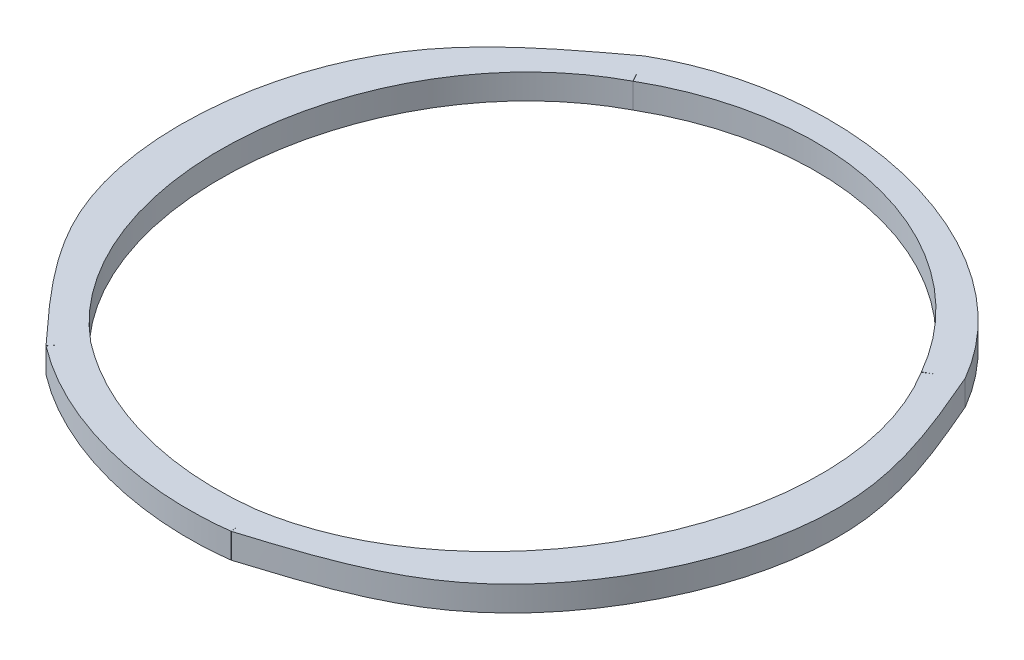
ISO-10303-21;
HEADER;
FILE_DESCRIPTION(('STEP AP214'),'2;1');
FILE_NAME('part.step','',(''),(''),'','','');
FILE_SCHEMA(('AUTOMOTIVE_DESIGN { 1 0 10303 214 1 1 1 1 }'));
ENDSEC;
DATA;
#1=APPLICATION_CONTEXT('core data for automotive mechanical design processes');
#2=APPLICATION_PROTOCOL_DEFINITION('international standard','automotive_design',2000,#1);
#3=PRODUCT_CONTEXT('',#1,'mechanical');
#4=PRODUCT('Part','Part','',(#3));
#5=PRODUCT_RELATED_PRODUCT_CATEGORY('part','',(#4));
#6=PRODUCT_DEFINITION_FORMATION('','',#4);
#7=PRODUCT_DEFINITION_CONTEXT('part definition',#1,'design');
#8=PRODUCT_DEFINITION('design','',#6,#7);
#9=PRODUCT_DEFINITION_SHAPE('','',#8);
#10=(LENGTH_UNIT() NAMED_UNIT(*) SI_UNIT(.MILLI.,.METRE.));
#11=(NAMED_UNIT(*) PLANE_ANGLE_UNIT() SI_UNIT($,.RADIAN.));
#12=(NAMED_UNIT(*) SI_UNIT($,.STERADIAN.) SOLID_ANGLE_UNIT());
#13=UNCERTAINTY_MEASURE_WITH_UNIT(LENGTH_MEASURE(1.E-05),#10,'distance_accuracy_value','');
#14=(GEOMETRIC_REPRESENTATION_CONTEXT(3) GLOBAL_UNCERTAINTY_ASSIGNED_CONTEXT((#13)) GLOBAL_UNIT_ASSIGNED_CONTEXT((#10,
#11,#12)) REPRESENTATION_CONTEXT('',''));
#15=CARTESIAN_POINT('',(0.,0.,0.));
#16=DIRECTION('',(0.,0.,1.));
#17=DIRECTION('',(1.,0.,0.));
#18=AXIS2_PLACEMENT_3D('',#15,#16,#17);
#19=CARTESIAN_POINT('',(73.417132814384,8.32364101588433,96.1287887539038));
#20=DIRECTION('',(0.991556404762285,0.,-0.129676120295497));
#21=DIRECTION('',(-0.129676120295497,0.,-0.991556404762285));
#22=AXIS2_PLACEMENT_3D('',#19,#20,#21);
#23=PLANE('',#22);
#24=CARTESIAN_POINT('',(73.417132814384,10.2482610941478,96.1287887539038));
#25=DIRECTION('',(-0.129676120295497,0.,-0.991556404762285));
#26=VECTOR('',#25,1.);
#27=LINE('',#24,#26);
#28=CARTESIAN_POINT('',(73.417132814384,10.2482610941478,96.1287887539038));
#29=VERTEX_POINT('',#28);
#30=CARTESIAN_POINT('',(73.3227946379132,10.2482610941478,95.4074406527145));
#31=VERTEX_POINT('',#30);
#32=EDGE_CURVE('E269',#29,#31,#27,.T.);
#33=ORIENTED_EDGE('',*,*,#32,.F.);
#34=CARTESIAN_POINT('',(73.4171328144663,8.32364101588433,96.1287887538932));
#35=DIRECTION('',(0.,1.,0.));
#36=VECTOR('',#35,1.);
#37=LINE('',#34,#36);
#38=CARTESIAN_POINT('',(73.417132814384,8.32364101588433,96.1287887539038));
#39=VERTEX_POINT('',#38);
#40=EDGE_CURVE('E36',#39,#29,#37,.T.);
#41=ORIENTED_EDGE('',*,*,#40,.F.);
#42=CARTESIAN_POINT('',(73.417132814384,8.32364101588433,96.1287887539038));
#43=DIRECTION('',(-0.129676120295497,0.,-0.991556404762285));
#44=VECTOR('',#43,1.);
#45=LINE('',#42,#44);
#46=CARTESIAN_POINT('',(73.3227946379132,8.32364101588433,95.4074406527145));
#47=VERTEX_POINT('',#46);
#48=EDGE_CURVE('E456',#39,#47,#45,.T.);
#49=ORIENTED_EDGE('',*,*,#48,.T.);
#50=CARTESIAN_POINT('',(73.3227946378621,8.32364101588433,95.4074406527211));
#51=DIRECTION('',(0.,1.,0.));
#52=VECTOR('',#51,1.);
#53=LINE('',#50,#52);
#54=EDGE_CURVE('E10',#47,#31,#53,.T.);
#55=ORIENTED_EDGE('',*,*,#54,.T.);
#56=EDGE_LOOP('',(#33,#41,#49,#55));
#57=FACE_BOUND('',#56,.T.);
#58=ADVANCED_FACE('F16',(#57),#23,.T.);
#59=CARTESIAN_POINT('',(73.3227946379132,8.32364101588433,95.4074406527145));
#60=DIRECTION('',(-0.989304022434079,0.,0.145868266582392));
#61=DIRECTION('',(0.145868266582392,0.,0.989304022434079));
#62=AXIS2_PLACEMENT_3D('',#59,#60,#61);
#63=PLANE('',#62);
#64=CARTESIAN_POINT('',(73.3227946379132,10.2482610941478,95.4074406527145));
#65=DIRECTION('',(0.145868266582392,0.,0.989304022434079));
#66=VECTOR('',#65,1.);
#67=LINE('',#64,#66);
#68=CARTESIAN_POINT('',(73.4289264997268,10.2482610941478,96.1272454482376));
#69=VERTEX_POINT('',#68);
#70=EDGE_CURVE('E273',#31,#69,#67,.T.);
#71=ORIENTED_EDGE('',*,*,#70,.F.);
#72=ORIENTED_EDGE('',*,*,#54,.F.);
#73=CARTESIAN_POINT('',(73.3227946379132,8.32364101588433,95.4074406527145));
#74=DIRECTION('',(0.145868266582392,0.,0.989304022434079));
#75=VECTOR('',#74,1.);
#76=LINE('',#73,#75);
#77=CARTESIAN_POINT('',(73.4289264997268,8.32364101588433,96.1272454482376));
#78=VERTEX_POINT('',#77);
#79=EDGE_CURVE('E451',#47,#78,#76,.T.);
#80=ORIENTED_EDGE('',*,*,#79,.T.);
#81=CARTESIAN_POINT('',(73.4289264997268,10.2482610941478,96.1272454482376));
#82=DIRECTION('',(0.,-1.,0.));
#83=VECTOR('',#82,1.);
#84=LINE('',#81,#83);
#85=EDGE_CURVE('E28',#78,#69,#84,.F.);
#86=ORIENTED_EDGE('',*,*,#85,.T.);
#87=EDGE_LOOP('',(#71,#72,#80,#86));
#88=FACE_BOUND('',#87,.T.);
#89=ADVANCED_FACE('F246',(#88),#63,.T.);
#90=CARTESIAN_POINT('',(73.4289264997268,8.32364101588433,96.1272454482376));
#91=CARTESIAN_POINT('',(77.4612799877984,8.32364101588433,94.8747266742085));
#92=CARTESIAN_POINT('',(85.5173569776394,8.32364101588433,92.3723697492394));
#93=CARTESIAN_POINT('',(93.5686983205206,8.32364101588433,82.1337973363639));
#94=CARTESIAN_POINT('',(96.4509246883731,8.32364101588433,69.3783635267655));
#95=CARTESIAN_POINT('',(93.124680797403,8.32364101588433,61.6041983656769));
#96=CARTESIAN_POINT('',(91.4587580916252,8.32364101588433,57.7105697909704));
#97=B_SPLINE_CURVE_WITH_KNOTS('',3,(#90,#91,#92,#93,#94,#95,#96),.UNSPECIFIED.,.F.,.F.,(4,1,1,1,
4),(0.,0.250187776831623,0.499840105297069,0.749498908553568,1.),.UNSPECIFIED.);
#98=DIRECTION('',(0.,1.,0.));
#99=VECTOR('',#98,1.);
#100=SURFACE_OF_LINEAR_EXTRUSION('',#97,#99);
#101=CARTESIAN_POINT('',(91.4587580916252,10.2482610941478,57.7105697909704));
#102=CARTESIAN_POINT('',(93.124680797403,10.2482610941478,61.6041983656769));
#103=CARTESIAN_POINT('',(96.4509246883731,10.2482610941478,69.3783635267655));
#104=CARTESIAN_POINT('',(93.5686983205206,10.2482610941478,82.1337973363639));
#105=CARTESIAN_POINT('',(85.5173569776394,10.2482610941478,92.3723697492394));
#106=CARTESIAN_POINT('',(77.4612799877984,10.2482610941478,94.8747266742085));
#107=CARTESIAN_POINT('',(73.4289264997268,10.2482610941478,96.1272454482376));
#108=B_SPLINE_CURVE_WITH_KNOTS('',3,(#101,#102,#103,#104,#105,#106,#107),.UNSPECIFIED.,.F.,.F.,
(4,1,1,1,4),(0.,0.250501091446432,0.500159894702931,0.749812223168377,1.),.UNSPECIFIED.);
#109=CARTESIAN_POINT('',(91.4576849072432,10.2482610941478,57.7111216559721));
#110=VERTEX_POINT('',#109);
#111=EDGE_CURVE('E275',#69,#110,#108,.F.);
#112=ORIENTED_EDGE('',*,*,#111,.F.);
#113=ORIENTED_EDGE('',*,*,#85,.F.);
#114=CARTESIAN_POINT('',(73.4289264997268,8.32364101588433,96.1272454482376));
#115=CARTESIAN_POINT('',(77.4612799877984,8.32364101588433,94.8747266742085));
#116=CARTESIAN_POINT('',(85.5173569776394,8.32364101588433,92.3723697492394));
#117=CARTESIAN_POINT('',(93.5686983205206,8.32364101588433,82.1337973363639));
#118=CARTESIAN_POINT('',(96.4509246883731,8.32364101588433,69.3783635267655));
#119=CARTESIAN_POINT('',(93.124680797403,8.32364101588433,61.6041983656769));
#120=CARTESIAN_POINT('',(91.4587580916252,8.32364101588433,57.7105697909704));
#121=B_SPLINE_CURVE_WITH_KNOTS('',3,(#114,#115,#116,#117,#118,#119,#120),.UNSPECIFIED.,.F.,.F.,
(4,1,1,1,4),(0.,0.250187776831623,0.499840105297069,0.749498908553568,1.),.UNSPECIFIED.);
#122=CARTESIAN_POINT('',(91.4576849072432,8.32364101588433,57.7111216559721));
#123=VERTEX_POINT('',#122);
#124=EDGE_CURVE('E448',#78,#123,#121,.T.);
#125=ORIENTED_EDGE('',*,*,#124,.T.);
#126=CARTESIAN_POINT('',(91.4587916146338,8.32364101588433,57.7106481416307));
#127=DIRECTION('',(0.,1.,0.));
#128=VECTOR('',#127,1.);
#129=LINE('',#126,#128);
#130=EDGE_CURVE('E617',#123,#110,#129,.T.);
#131=ORIENTED_EDGE('',*,*,#130,.T.);
#132=EDGE_LOOP('',(#112,#113,#125,#131));
#133=FACE_BOUND('',#132,.T.);
#134=ADVANCED_FACE('F431',(#133),#100,.T.);
#135=CARTESIAN_POINT('',(91.4584462335252,8.32364101588433,57.7124479834406));
#136=CARTESIAN_POINT('',(85.1970956555128,8.3236410158836,46.8033867608488));
#137=CARTESIAN_POINT('',(68.5988380616388,8.32364101588469,42.3156651504212));
#138=CARTESIAN_POINT('',(57.6800117025054,8.32364101588434,48.5601531529404));
#139=B_SPLINE_CURVE_WITH_KNOTS('',3,(#135,#136,#137,#138),.UNSPECIFIED.,.F.,.F.,(4,4),(0.,
1.00018311291933),.UNSPECIFIED.);
#140=DIRECTION('',(0.,1.,0.));
#141=VECTOR('',#140,1.);
#142=SURFACE_OF_LINEAR_EXTRUSION('',#139,#141);
#143=CARTESIAN_POINT('',(91.4584462335252,10.2482610941478,57.7124479834406));
#144=CARTESIAN_POINT('',(85.1970956555128,10.248261094147,46.8033867608488));
#145=CARTESIAN_POINT('',(68.5988380616388,10.2482610941481,42.3156651504212));
#146=CARTESIAN_POINT('',(57.6800117025054,10.2482610941478,48.5601531529404));
#147=B_SPLINE_CURVE_WITH_KNOTS('',3,(#143,#144,#145,#146),.UNSPECIFIED.,.F.,.F.,(4,4),(0.,
1.00018311291933),.UNSPECIFIED.);
#148=CARTESIAN_POINT('',(57.6825523338887,10.2482610941478,48.5584825610413));
#149=VERTEX_POINT('',#148);
#150=EDGE_CURVE('E292',#110,#149,#147,.T.);
#151=ORIENTED_EDGE('',*,*,#150,.F.);
#152=ORIENTED_EDGE('',*,*,#130,.F.);
#153=CARTESIAN_POINT('',(57.6825523338887,8.32364101588434,48.5584825610413));
#154=VERTEX_POINT('',#153);
#155=EDGE_CURVE('E438',#123,#154,#139,.T.);
#156=ORIENTED_EDGE('',*,*,#155,.T.);
#157=CARTESIAN_POINT('',(57.6826462009607,8.32364101588434,48.5586467518329));
#158=DIRECTION('',(0.,1.,0.));
#159=VECTOR('',#158,1.);
#160=LINE('',#157,#159);
#161=EDGE_CURVE('E405',#154,#149,#160,.T.);
#162=ORIENTED_EDGE('',*,*,#161,.T.);
#163=EDGE_LOOP('',(#151,#152,#156,#162));
#164=FACE_BOUND('',#163,.T.);
#165=ADVANCED_FACE('F422',(#164),#142,.T.);
#166=CARTESIAN_POINT('',(57.6824634333342,8.32364101588434,48.5583155309152));
#167=DIRECTION('',(-0.46983846824881,0.,-0.882752407956847));
#168=DIRECTION('',(-0.882752407956847,0.,0.46983846824881));
#169=AXIS2_PLACEMENT_3D('',#166,#167,#168);
#170=PLANE('',#169);
#171=CARTESIAN_POINT('',(57.7032195434821,10.2482610941478,48.5472682441439));
#172=CARTESIAN_POINT('',(57.6892293038282,10.2482610941478,48.5547144461708));
#173=CARTESIAN_POINT('',(57.6752390641745,10.2482610941478,48.5621606481977));
#174=CARTESIAN_POINT('',(57.6612488245214,10.2482610941478,48.5696068502242));
#175=B_SPLINE_CURVE_WITH_KNOTS('',3,(#171,#172,#173,#174),.UNSPECIFIED.,.F.,.F.,(4,4),(0.,1.),.UNSPECIFIED.);
#176=CARTESIAN_POINT('',(57.6612488245214,10.2482610941478,48.5696068502242));
#177=VERTEX_POINT('',#176);
#178=EDGE_CURVE('E298',#149,#177,#175,.T.);
#179=ORIENTED_EDGE('',*,*,#178,.F.);
#180=ORIENTED_EDGE('',*,*,#161,.F.);
#181=CARTESIAN_POINT('',(57.7032195434821,8.32364101588433,48.5472682441439));
#182=CARTESIAN_POINT('',(57.6892293038282,8.32364101588433,48.5547144461708));
#183=CARTESIAN_POINT('',(57.6752390641745,8.32364101588433,48.5621606481977));
#184=CARTESIAN_POINT('',(57.6612488245214,8.32364101588433,48.5696068502242));
#185=B_SPLINE_CURVE_WITH_KNOTS('',3,(#181,#182,#183,#184),.UNSPECIFIED.,.F.,.F.,(4,4),(0.,1.),.UNSPECIFIED.);
#186=CARTESIAN_POINT('',(57.6612488245214,8.32364101588433,48.5696068502242));
#187=VERTEX_POINT('',#186);
#188=EDGE_CURVE('E439',#154,#187,#185,.T.);
#189=ORIENTED_EDGE('',*,*,#188,.T.);
#190=CARTESIAN_POINT('',(57.6611848127527,10.2482610941478,48.5695205447004));
#191=DIRECTION('',(0.,-1.,0.));
#192=VECTOR('',#191,1.);
#193=LINE('',#190,#192);
#194=EDGE_CURVE('E385',#187,#177,#193,.F.);
#195=ORIENTED_EDGE('',*,*,#194,.T.);
#196=EDGE_LOOP('',(#179,#180,#189,#195));
#197=FACE_BOUND('',#196,.T.);
#198=ADVANCED_FACE('F353',(#197),#170,.T.);
#199=CARTESIAN_POINT('',(58.0687336212588,8.32364101588433,48.2672464967746));
#200=CARTESIAN_POINT('',(57.9326910467751,8.32364101588433,48.3681476374997));
#201=CARTESIAN_POINT('',(57.7966484722914,8.32364101588433,48.4690487782249));
#202=CARTESIAN_POINT('',(57.6606058978076,8.32364101588433,48.56994991895));
#203=CARTESIAN_POINT('',(54.2540866245869,8.32364101588433,51.0965242790314));
#204=CARTESIAN_POINT('',(47.4523651447153,8.32364101588433,56.1412792670784));
#205=CARTESIAN_POINT('',(43.5196093864741,8.32364101588433,68.6358033580431));
#206=CARTESIAN_POINT('',(45.344989195616,8.32364101588433,81.5591265763293));
#207=CARTESIAN_POINT('',(51.0725485533074,8.32364101588433,87.7779694919688));
#208=CARTESIAN_POINT('',(53.9413465535882,8.32364101588433,90.892839719632));
#209=B_SPLINE_CURVE_WITH_KNOTS('',3,(#199,#200,#201,#202,#203,#204,#205,#206,#207,#208),
.UNSPECIFIED.,.F.,.F.,(4,3,1,1,1,4),(-0.01,0.,0.250400970883418,0.499970064936165,
0.749546920737653,1.),.UNSPECIFIED.);
#210=DIRECTION('',(0.,1.,0.));
#211=VECTOR('',#210,1.);
#212=SURFACE_OF_LINEAR_EXTRUSION('',#209,#211);
#213=CARTESIAN_POINT('',(53.9413465535882,10.2482610941478,90.892839719632));
#214=CARTESIAN_POINT('',(51.0725485533074,10.2482610941478,87.7779694919688));
#215=CARTESIAN_POINT('',(45.344989195616,10.2482610941478,81.5591265763293));
#216=CARTESIAN_POINT('',(43.5196093864741,10.2482610941478,68.6358033580431));
#217=CARTESIAN_POINT('',(47.4523651447153,10.2482610941478,56.1412792670784));
#218=CARTESIAN_POINT('',(54.2540866245869,10.2482610941478,51.0965242790314));
#219=CARTESIAN_POINT('',(57.6606058978076,10.2482610941478,48.56994991895));
#220=B_SPLINE_CURVE_WITH_KNOTS('',3,(#213,#214,#215,#216,#217,#218,#219),.UNSPECIFIED.,.F.,.F.,
(4,1,1,1,4),(0.,0.250453079262347,0.500029935063835,0.749599029116582,1.),.UNSPECIFIED.);
#221=CARTESIAN_POINT('',(53.9413465535882,10.2482610941478,90.892839719632));
#222=VERTEX_POINT('',#221);
#223=EDGE_CURVE('E308',#177,#222,#220,.F.);
#224=ORIENTED_EDGE('',*,*,#223,.F.);
#225=ORIENTED_EDGE('',*,*,#194,.F.);
#226=CARTESIAN_POINT('',(57.6606058978076,8.32364101588433,48.56994991895));
#227=CARTESIAN_POINT('',(54.2540866245869,8.32364101588433,51.0965242790314));
#228=CARTESIAN_POINT('',(47.4523651447153,8.32364101588433,56.1412792670784));
#229=CARTESIAN_POINT('',(43.5196093864741,8.32364101588433,68.6358033580431));
#230=CARTESIAN_POINT('',(45.344989195616,8.32364101588433,81.5591265763293));
#231=CARTESIAN_POINT('',(51.0725485533074,8.32364101588433,87.7779694919688));
#232=CARTESIAN_POINT('',(53.9413465535882,8.32364101588433,90.892839719632));
#233=B_SPLINE_CURVE_WITH_KNOTS('',3,(#226,#227,#228,#229,#230,#231,#232),.UNSPECIFIED.,.F.,.F.,
(4,1,1,1,4),(0.,0.250400970883418,0.499970064936165,0.749546920737653,1.),.UNSPECIFIED.);
#234=CARTESIAN_POINT('',(53.9413465535882,8.32364101588433,90.892839719632));
#235=VERTEX_POINT('',#234);
#236=EDGE_CURVE('E444',#187,#235,#233,.T.);
#237=ORIENTED_EDGE('',*,*,#236,.T.);
#238=CARTESIAN_POINT('',(53.9413465535882,8.32364101588433,90.892839719632));
#239=DIRECTION('',(0.,1.,0.));
#240=VECTOR('',#239,1.);
#241=LINE('',#238,#240);
#242=EDGE_CURVE('E888',#235,#222,#241,.T.);
#243=ORIENTED_EDGE('',*,*,#242,.T.);
#244=EDGE_LOOP('',(#224,#225,#237,#243));
#245=FACE_BOUND('',#244,.T.);
#246=ADVANCED_FACE('F347',(#245),#212,.T.);
#247=CARTESIAN_POINT('',(53.9413465535882,8.32364101588433,90.892839719632));
#248=DIRECTION('',(0.783634023209312,0.,0.621222760102032));
#249=DIRECTION('',(0.621222760102032,0.,-0.783634023209312));
#250=AXIS2_PLACEMENT_3D('',#247,#248,#249);
#251=PLANE('',#250);
#252=CARTESIAN_POINT('',(53.9413465535882,10.2482610941478,90.892839719632));
#253=DIRECTION('',(0.621222760102032,0.,-0.783634023209312));
#254=VECTOR('',#253,1.);
#255=LINE('',#252,#254);
#256=CARTESIAN_POINT('',(54.3933408770972,10.2482610941478,90.3226768844183));
#257=VERTEX_POINT('',#256);
#258=EDGE_CURVE('E560',#222,#257,#255,.T.);
#259=ORIENTED_EDGE('',*,*,#258,.F.);
#260=ORIENTED_EDGE('',*,*,#242,.F.);
#261=CARTESIAN_POINT('',(53.9413465535882,8.32364101588433,90.892839719632));
#262=DIRECTION('',(0.621222760102032,0.,-0.783634023209312));
#263=VECTOR('',#262,1.);
#264=LINE('',#261,#263);
#265=CARTESIAN_POINT('',(54.3933408770972,8.32364101588433,90.3226768844183));
#266=VERTEX_POINT('',#265);
#267=EDGE_CURVE('E177',#235,#266,#264,.T.);
#268=ORIENTED_EDGE('',*,*,#267,.T.);
#269=CARTESIAN_POINT('',(54.3933408770972,8.32364101588433,90.3226768844183));
#270=DIRECTION('',(0.,1.,0.));
#271=VECTOR('',#270,1.);
#272=LINE('',#269,#271);
#273=EDGE_CURVE('E165',#266,#257,#272,.T.);
#274=ORIENTED_EDGE('',*,*,#273,.T.);
#275=EDGE_LOOP('',(#259,#260,#268,#274));
#276=FACE_BOUND('',#275,.T.);
#277=ADVANCED_FACE('F352',(#276),#251,.T.);
#278=CARTESIAN_POINT('',(54.3933408770972,8.32364101588433,90.3226768844183));
#279=DIRECTION('',(-0.793761942021533,0.,-0.608228558519085));
#280=DIRECTION('',(-0.608228558519085,0.,0.793761942021533));
#281=AXIS2_PLACEMENT_3D('',#278,#279,#280);
#282=PLANE('',#281);
#283=CARTESIAN_POINT('',(54.3933408770972,10.2482610941478,90.3226768844183));
#284=DIRECTION('',(-0.608228558519085,0.,0.793761942021533));
#285=VECTOR('',#284,1.);
#286=LINE('',#283,#285);
#287=CARTESIAN_POINT('',(53.9508607905661,10.2482610941478,90.9001306193201));
#288=VERTEX_POINT('',#287);
#289=EDGE_CURVE('E318',#257,#288,#286,.T.);
#290=ORIENTED_EDGE('',*,*,#289,.F.);
#291=ORIENTED_EDGE('',*,*,#273,.F.);
#292=CARTESIAN_POINT('',(54.3933408770972,8.32364101588433,90.3226768844183));
#293=DIRECTION('',(-0.608228558519085,0.,0.793761942021533));
#294=VECTOR('',#293,1.);
#295=LINE('',#292,#294);
#296=CARTESIAN_POINT('',(53.9508607905661,8.32364101588433,90.9001306193201));
#297=VERTEX_POINT('',#296);
#298=EDGE_CURVE('E169',#266,#297,#295,.T.);
#299=ORIENTED_EDGE('',*,*,#298,.T.);
#300=CARTESIAN_POINT('',(53.9508607905661,8.32364101588433,90.9001306193201));
#301=DIRECTION('',(0.,1.,0.));
#302=VECTOR('',#301,1.);
#303=LINE('',#300,#302);
#304=EDGE_CURVE('E152',#297,#288,#303,.T.);
#305=ORIENTED_EDGE('',*,*,#304,.T.);
#306=EDGE_LOOP('',(#290,#291,#299,#305));
#307=FACE_BOUND('',#306,.T.);
#308=ADVANCED_FACE('F171',(#307),#282,.T.);
#309=CARTESIAN_POINT('',(53.9508607905661,8.32364101588433,90.9001306193201));
#310=DIRECTION('',(-0.608228558519024,0.,0.79376194202158));
#311=DIRECTION('',(0.79376194202158,0.,0.608228558519024));
#312=AXIS2_PLACEMENT_3D('',#309,#310,#311);
#313=PLANE('',#312);
#314=CARTESIAN_POINT('',(53.9508607905661,10.2482610941478,90.9001306193201));
#315=CARTESIAN_POINT('',(53.9652223715285,10.2482610941478,90.9111353339888));
#316=CARTESIAN_POINT('',(53.9795839524906,10.2482610941478,90.9221400486572));
#317=CARTESIAN_POINT('',(53.9939455334529,10.2482610941478,90.9331447633258));
#318=B_SPLINE_CURVE_WITH_KNOTS('',3,(#314,#315,#316,#317),.UNSPECIFIED.,.F.,.F.,(4,4),(0.,1.),.UNSPECIFIED.);
#319=CARTESIAN_POINT('',(53.9944867477314,10.2482610941478,90.9335592389617));
#320=VERTEX_POINT('',#319);
#321=EDGE_CURVE('E160',#288,#320,#318,.T.);
#322=ORIENTED_EDGE('',*,*,#321,.F.);
#323=ORIENTED_EDGE('',*,*,#304,.F.);
#324=CARTESIAN_POINT('',(53.9508607905661,8.32364101588433,90.9001306193201));
#325=CARTESIAN_POINT('',(53.9652223715285,8.32364101588433,90.9111353339888));
#326=CARTESIAN_POINT('',(53.9795839524906,8.32364101588433,90.9221400486572));
#327=CARTESIAN_POINT('',(53.9939455334529,8.32364101588433,90.9331447633258));
#328=B_SPLINE_CURVE_WITH_KNOTS('',3,(#324,#325,#326,#327),.UNSPECIFIED.,.F.,.F.,(4,4),(0.,1.),.UNSPECIFIED.);
#329=CARTESIAN_POINT('',(53.9944867477314,8.32364101588433,90.9335592389617));
#330=VERTEX_POINT('',#329);
#331=EDGE_CURVE('E157',#297,#330,#328,.T.);
#332=ORIENTED_EDGE('',*,*,#331,.T.);
#333=CARTESIAN_POINT('',(53.9944866665007,10.2482610941478,90.9335593453028));
#334=DIRECTION('',(0.,-1.,0.));
#335=VECTOR('',#334,1.);
#336=LINE('',#333,#335);
#337=EDGE_CURVE('E95',#330,#320,#336,.F.);
#338=ORIENTED_EDGE('',*,*,#337,.T.);
#339=EDGE_LOOP('',(#322,#323,#332,#338));
#340=FACE_BOUND('',#339,.T.);
#341=ADVANCED_FACE('F155',(#340),#313,.T.);
#342=CARTESIAN_POINT('',(58.5412779961459,8.32364101588433,50.0576408106166));
#343=DIRECTION('',(0.884582930396932,0.,-0.4663829319887));
#344=DIRECTION('',(-0.4663829319887,0.,-0.884582930396932));
#345=AXIS2_PLACEMENT_3D('',#342,#343,#344);
#346=PLANE('',#345);
#347=DIRECTION('',(-0.466382931988699,0.,-0.884582930396932));
#348=VECTOR('',#347,1.);
#349=CARTESIAN_POINT('',(58.5412779961459,10.2482610941478,50.0576408106166));
#350=LINE('',#349,#348);
#351=CARTESIAN_POINT('',(58.880566832904,10.2482610941478,50.7011658902987));
#352=VERTEX_POINT('',#351);
#353=CARTESIAN_POINT('',(58.5412779961459,10.2482610941478,50.0576408106166));
#354=VERTEX_POINT('',#353);
#355=EDGE_CURVE('E518',#352,#354,#350,.T.);
#356=ORIENTED_EDGE('',*,*,#355,.F.);
#357=DIRECTION('',(0.,1.,0.));
#358=VECTOR('',#357,1.);
#359=CARTESIAN_POINT('',(58.880566832904,8.32364101588433,50.7011658902987));
#360=LINE('',#359,#358);
#361=CARTESIAN_POINT('',(58.880566832904,8.32364101588433,50.7011658902987));
#362=VERTEX_POINT('',#361);
#363=EDGE_CURVE('E184',#362,#352,#360,.T.);
#364=ORIENTED_EDGE('',*,*,#363,.F.);
#365=DIRECTION('',(-0.466382931988699,0.,-0.884582930396932));
#366=VECTOR('',#365,1.);
#367=CARTESIAN_POINT('',(58.5412779961459,8.32364101588433,50.0576408106166));
#368=LINE('',#367,#366);
#369=CARTESIAN_POINT('',(58.5412779961459,8.32364101588433,50.0576408106166));
#370=VERTEX_POINT('',#369);
#371=EDGE_CURVE('E327',#362,#370,#368,.T.);
#372=ORIENTED_EDGE('',*,*,#371,.T.);
#373=DIRECTION('',(0.,1.,0.));
#374=VECTOR('',#373,1.);
#375=CARTESIAN_POINT('',(58.5412779961459,8.32364101588433,50.0576408106166));
#376=LINE('',#375,#374);
#377=EDGE_CURVE('E108',#370,#354,#376,.T.);
#378=ORIENTED_EDGE('',*,*,#377,.T.);
#379=EDGE_LOOP('',(#356,#364,#372,#378));
#380=FACE_BOUND('',#379,.T.);
#381=ADVANCED_FACE('F18',(#380),#346,.T.);
#382=CARTESIAN_POINT('',(58.5412779961459,8.32364101588433,50.0576408106166));
#383=DIRECTION('',(-0.867059095190592,0.,0.49820530451539));
#384=DIRECTION('',(0.49820530451539,0.,0.867059095190592));
#385=AXIS2_PLACEMENT_3D('',#382,#383,#384);
#386=PLANE('',#385);
#387=DIRECTION('',(0.49820530451539,0.,0.867059095190592));
#388=VECTOR('',#387,1.);
#389=CARTESIAN_POINT('',(58.5412779961459,10.2482610941478,50.0576408106166));
#390=LINE('',#389,#388);
#391=CARTESIAN_POINT('',(58.9037172850687,10.2482610941478,50.6884174785219));
#392=VERTEX_POINT('',#391);
#393=EDGE_CURVE('E513',#354,#392,#390,.T.);
#394=ORIENTED_EDGE('',*,*,#393,.F.);
#395=ORIENTED_EDGE('',*,*,#377,.F.);
#396=DIRECTION('',(0.49820530451539,0.,0.867059095190592));
#397=VECTOR('',#396,1.);
#398=CARTESIAN_POINT('',(58.5412779961459,8.32364101588433,50.0576408106166));
#399=LINE('',#398,#397);
#400=CARTESIAN_POINT('',(58.9037172850687,8.32364101588433,50.6884174785219));
#401=VERTEX_POINT('',#400);
#402=EDGE_CURVE('E874',#370,#401,#399,.T.);
#403=ORIENTED_EDGE('',*,*,#402,.T.);
#404=DIRECTION('',(0.,1.,0.));
#405=VECTOR('',#404,1.);
#406=CARTESIAN_POINT('',(58.9037172850687,8.32364101588433,50.6884174785219));
#407=LINE('',#406,#405);
#408=EDGE_CURVE('E514',#401,#392,#407,.T.);
#409=ORIENTED_EDGE('',*,*,#408,.T.);
#410=EDGE_LOOP('',(#394,#395,#403,#409));
#411=FACE_BOUND('',#410,.T.);
#412=ADVANCED_FACE('F504',(#411),#386,.T.);
#413=CARTESIAN_POINT('',(70.,8.32364101588433,70.0000000000001));
#414=DIRECTION('',(0.,1.,0.));
#415=DIRECTION('',(-1.,0.,0.));
#416=AXIS2_PLACEMENT_3D('',#413,#414,#415);
#417=CYLINDRICAL_SURFACE('',#416,22.2725101767526);
#418=CARTESIAN_POINT('',(70.,10.2482610941478,70.0000000000001));
#419=DIRECTION('',(0.,-1.,0.));
#420=DIRECTION('',(-0.498205304515399,0.,-0.867059095190587));
#421=AXIS2_PLACEMENT_3D('',#418,#419,#420);
#422=CIRCLE('',#421,22.2725101767526);
#423=CARTESIAN_POINT('',(89.3506406695916,10.2482610941478,58.9719713797119));
#424=VERTEX_POINT('',#423);
#425=EDGE_CURVE('E517',#392,#424,#422,.T.);
#426=ORIENTED_EDGE('',*,*,#425,.F.);
#427=ORIENTED_EDGE('',*,*,#408,.F.);
#428=CARTESIAN_POINT('',(70.,8.32364101588433,70.0000000000001));
#429=DIRECTION('',(0.,-1.,0.));
#430=DIRECTION('',(-0.498205304515399,0.,-0.867059095190587));
#431=AXIS2_PLACEMENT_3D('',#428,#429,#430);
#432=CIRCLE('',#431,22.2725101767526);
#433=CARTESIAN_POINT('',(89.3506406695916,8.32364101588433,58.9719713797119));
#434=VERTEX_POINT('',#433);
#435=EDGE_CURVE('E876',#401,#434,#432,.T.);
#436=ORIENTED_EDGE('',*,*,#435,.T.);
#437=DIRECTION('',(0.,1.,0.));
#438=VECTOR('',#437,1.);
#439=CARTESIAN_POINT('',(89.3506406695916,8.32364101588433,58.9719713797119));
#440=LINE('',#439,#438);
#441=EDGE_CURVE('E555',#434,#424,#440,.T.);
#442=ORIENTED_EDGE('',*,*,#441,.T.);
#443=EDGE_LOOP('',(#426,#427,#436,#442));
#444=FACE_BOUND('',#443,.T.);
#445=ADVANCED_FACE('F501',(#444),#417,.F.);
#446=CARTESIAN_POINT('',(89.3506406695916,8.32364101588433,58.9719713797119));
#447=DIRECTION('',(0.495140805089803,0.,0.868812743423473));
#448=DIRECTION('',(0.868812743423473,0.,-0.495140805089803));
#449=AXIS2_PLACEMENT_3D('',#446,#447,#448);
#450=PLANE('',#449);
#451=DIRECTION('',(0.868812743423473,0.,-0.495140805089803));
#452=VECTOR('',#451,1.);
#453=CARTESIAN_POINT('',(89.3506406695916,10.2482610941478,58.9719713797119));
#454=LINE('',#453,#452);
#455=CARTESIAN_POINT('',(89.9826930987399,10.2482610941478,58.6117614829346));
#456=VERTEX_POINT('',#455);
#457=EDGE_CURVE('E527',#424,#456,#454,.T.);
#458=ORIENTED_EDGE('',*,*,#457,.F.);
#459=ORIENTED_EDGE('',*,*,#441,.F.);
#460=DIRECTION('',(0.868812743423473,0.,-0.495140805089803));
#461=VECTOR('',#460,1.);
#462=CARTESIAN_POINT('',(89.3506406695916,8.32364101588433,58.9719713797119));
#463=LINE('',#462,#461);
#464=CARTESIAN_POINT('',(89.9826930987399,8.32364101588433,58.6117614829346));
#465=VERTEX_POINT('',#464);
#466=EDGE_CURVE('E879',#434,#465,#463,.T.);
#467=ORIENTED_EDGE('',*,*,#466,.T.);
#468=DIRECTION('',(0.,1.,0.));
#469=VECTOR('',#468,1.);
#470=CARTESIAN_POINT('',(89.9826930987399,8.32364101588433,58.6117614829346));
#471=LINE('',#470,#469);
#472=EDGE_CURVE('E553',#465,#456,#471,.T.);
#473=ORIENTED_EDGE('',*,*,#472,.T.);
#474=EDGE_LOOP('',(#458,#459,#467,#473));
#475=FACE_BOUND('',#474,.T.);
#476=ADVANCED_FACE('F497',(#475),#450,.T.);
#477=CARTESIAN_POINT('',(89.3639317225041,8.32364101588434,58.99435239005));
#478=DIRECTION('',(-0.525905510825684,0.,-0.850542999314659));
#479=DIRECTION('',(-0.850542999314659,0.,0.525905510825684));
#480=AXIS2_PLACEMENT_3D('',#477,#478,#479);
#481=PLANE('',#480);
#482=DIRECTION('',(-0.850542999314659,0.,0.525905510825684));
#483=VECTOR('',#482,1.);
#484=CARTESIAN_POINT('',(89.3639317225041,10.2482610941478,58.99435239005));
#485=LINE('',#484,#483);
#486=CARTESIAN_POINT('',(89.3639317225041,10.2482610941478,58.99435239005));
#487=VERTEX_POINT('',#486);
#488=EDGE_CURVE('E530',#456,#487,#485,.T.);
#489=ORIENTED_EDGE('',*,*,#488,.F.);
#490=ORIENTED_EDGE('',*,*,#472,.F.);
#491=DIRECTION('',(-0.850542999314659,0.,0.525905510825684));
#492=VECTOR('',#491,1.);
#493=CARTESIAN_POINT('',(89.3639317225041,8.32364101588434,58.99435239005));
#494=LINE('',#493,#492);
#495=CARTESIAN_POINT('',(89.3639317225041,8.32364101588433,58.99435239005));
#496=VERTEX_POINT('',#495);
#497=EDGE_CURVE('E881',#465,#496,#494,.T.);
#498=ORIENTED_EDGE('',*,*,#497,.T.);
#499=DIRECTION('',(0.,1.,0.));
#500=VECTOR('',#499,1.);
#501=CARTESIAN_POINT('',(89.3639317225041,8.32364101588433,58.99435239005));
#502=LINE('',#501,#500);
#503=EDGE_CURVE('E542',#496,#487,#502,.T.);
#504=ORIENTED_EDGE('',*,*,#503,.T.);
#505=EDGE_LOOP('',(#489,#490,#498,#504));
#506=FACE_BOUND('',#505,.T.);
#507=ADVANCED_FACE('F493',(#506),#481,.T.);
#508=CARTESIAN_POINT('',(89.3639317225041,8.32364101588434,58.99435239005));
#509=CARTESIAN_POINT('',(97.3714531773029,8.32364101588439,71.9448561878673));
#510=CARTESIAN_POINT('',(88.0237079673836,8.32364101588431,91.2917688924139));
#511=CARTESIAN_POINT('',(72.9668302737575,8.32364101588433,93.711853231069));
#512=B_SPLINE_CURVE_WITH_KNOTS('',3,(#508,#509,#510,#511),.UNSPECIFIED.,.F.,.F.,(4,4),(0.,1.),.UNSPECIFIED.);
#513=DIRECTION('',(0.,1.,0.));
#514=VECTOR('',#513,1.);
#515=SURFACE_OF_LINEAR_EXTRUSION('',#512,#514);
#516=CARTESIAN_POINT('',(89.3639317225041,10.2482610941478,58.99435239005));
#517=CARTESIAN_POINT('',(97.3714531773029,10.2482610941478,71.9448561878673));
#518=CARTESIAN_POINT('',(88.0237079673836,10.2482610941477,91.2917688924139));
#519=CARTESIAN_POINT('',(72.9668302737575,10.2482610941478,93.711853231069));
#520=B_SPLINE_CURVE_WITH_KNOTS('',3,(#516,#517,#518,#519),.UNSPECIFIED.,.F.,.F.,(4,4),(0.,1.),.UNSPECIFIED.);
#521=CARTESIAN_POINT('',(72.9789754611381,10.2482610941478,93.7098972709059));
#522=VERTEX_POINT('',#521);
#523=EDGE_CURVE('E284',#487,#522,#520,.T.);
#524=ORIENTED_EDGE('',*,*,#523,.F.);
#525=ORIENTED_EDGE('',*,*,#503,.F.);
#526=CARTESIAN_POINT('',(72.9789754611381,8.32364101588433,93.7098972709059));
#527=VERTEX_POINT('',#526);
#528=EDGE_CURVE('E467',#496,#527,#512,.T.);
#529=ORIENTED_EDGE('',*,*,#528,.T.);
#530=DIRECTION('',(0.,1.,0.));
#531=VECTOR('',#530,1.);
#532=CARTESIAN_POINT('',(72.9789754611381,8.32364101588433,93.7098972709059));
#533=LINE('',#532,#531);
#534=EDGE_CURVE('E544',#527,#522,#533,.T.);
#535=ORIENTED_EDGE('',*,*,#534,.T.);
#536=EDGE_LOOP('',(#524,#525,#529,#535));
#537=FACE_BOUND('',#536,.T.);
#538=ADVANCED_FACE('F489',(#537),#515,.T.);
#539=CARTESIAN_POINT('',(72.9912142680968,8.32364101588433,93.7083564120004));
#540=CARTESIAN_POINT('',(66.7584951107953,8.32364101588433,94.4947204327013));
#541=CARTESIAN_POINT('',(60.3652560337255,8.32364101588436,92.7524959045689));
#542=CARTESIAN_POINT('',(55.393051721063,8.32364101588433,88.9121809565306));
#543=B_SPLINE_CURVE_WITH_KNOTS('',3,(#539,#540,#541,#542),.UNSPECIFIED.,.F.,.F.,(4,4),(0.,1.),.UNSPECIFIED.);
#544=DIRECTION('',(0.,1.,0.));
#545=VECTOR('',#544,1.);
#546=SURFACE_OF_LINEAR_EXTRUSION('',#543,#545);
#547=CARTESIAN_POINT('',(72.9912142680968,10.2482610941478,93.7083564120004));
#548=CARTESIAN_POINT('',(66.7584951107953,10.2482610941478,94.4947204327013));
#549=CARTESIAN_POINT('',(60.3652560337255,10.2482610941478,92.7524959045689));
#550=CARTESIAN_POINT('',(55.393051721063,10.2482610941478,88.9121809565306));
#551=B_SPLINE_CURVE_WITH_KNOTS('',3,(#547,#548,#549,#550),.UNSPECIFIED.,.F.,.F.,(4,4),(0.,1.),.UNSPECIFIED.);
#552=CARTESIAN_POINT('',(55.4028892849713,10.2482610941478,88.9197748964103));
#553=VERTEX_POINT('',#552);
#554=EDGE_CURVE('E277',#522,#553,#551,.T.);
#555=ORIENTED_EDGE('',*,*,#554,.F.);
#556=ORIENTED_EDGE('',*,*,#534,.F.);
#557=CARTESIAN_POINT('',(55.4028892849713,8.32364101588433,88.9197748964103));
#558=VERTEX_POINT('',#557);
#559=EDGE_CURVE('E462',#527,#558,#543,.T.);
#560=ORIENTED_EDGE('',*,*,#559,.T.);
#561=DIRECTION('',(0.,1.,0.));
#562=VECTOR('',#561,1.);
#563=CARTESIAN_POINT('',(55.4028892849713,8.32364101588433,88.9197748964103));
#564=LINE('',#563,#562);
#565=EDGE_CURVE('E547',#558,#553,#564,.T.);
#566=ORIENTED_EDGE('',*,*,#565,.T.);
#567=EDGE_LOOP('',(#555,#556,#560,#566));
#568=FACE_BOUND('',#567,.T.);
#569=ADVANCED_FACE('F486',(#568),#546,.T.);
#570=CARTESIAN_POINT('',(55.4124316480296,8.32364101588433,88.9276840585312));
#571=CARTESIAN_POINT('',(43.667069837993,8.32364101588431,79.1987604495138));
#572=CARTESIAN_POINT('',(45.4095658103616,8.32364101588428,57.8035468404904));
#573=CARTESIAN_POINT('',(58.880566832904,8.32364101588433,50.7011658902987));
#574=B_SPLINE_CURVE_WITH_KNOTS('',3,(#570,#571,#572,#573),.UNSPECIFIED.,.F.,.F.,(4,4),(0.,1.),.UNSPECIFIED.);
#575=DIRECTION('',(0.,1.,0.));
#576=VECTOR('',#575,1.);
#577=SURFACE_OF_LINEAR_EXTRUSION('',#574,#576);
#578=CARTESIAN_POINT('',(55.4124316480296,10.2482610941478,88.9276840585312));
#579=CARTESIAN_POINT('',(43.667069837993,10.2482610941477,79.1987604495138));
#580=CARTESIAN_POINT('',(45.4095658103616,10.2482610941477,57.8035468404904));
#581=CARTESIAN_POINT('',(58.880566832904,10.2482610941478,50.7011658902987));
#582=B_SPLINE_CURVE_WITH_KNOTS('',3,(#578,#579,#580,#581),.UNSPECIFIED.,.F.,.F.,(4,4),(0.,1.),.UNSPECIFIED.);
#583=EDGE_CURVE('E274',#553,#352,#582,.T.);
#584=ORIENTED_EDGE('',*,*,#583,.F.);
#585=ORIENTED_EDGE('',*,*,#565,.F.);
#586=EDGE_CURVE('E460',#558,#362,#574,.T.);
#587=ORIENTED_EDGE('',*,*,#586,.T.);
#588=ORIENTED_EDGE('',*,*,#363,.T.);
#589=EDGE_LOOP('',(#584,#585,#587,#588));
#590=FACE_BOUND('',#589,.T.);
#591=ADVANCED_FACE('F215',(#590),#577,.T.);
#592=CARTESIAN_POINT('',(53.9937244795493,8.32364101588433,90.932977434774));
#593=CARTESIAN_POINT('',(59.3091102984388,8.32364101588434,94.9913180990307));
#594=CARTESIAN_POINT('',(66.7870892786639,8.32364101588434,96.9860109908389));
#595=CARTESIAN_POINT('',(73.419369489267,8.32364101588434,96.1284996784492));
#596=B_SPLINE_CURVE_WITH_KNOTS('',3,(#592,#593,#594,#595),.UNSPECIFIED.,.F.,.F.,(4,4),(0.,
1.00025025770068),.UNSPECIFIED.);
#597=DIRECTION('',(0.,1.,0.));
#598=VECTOR('',#597,1.);
#599=SURFACE_OF_LINEAR_EXTRUSION('',#596,#598);
#600=CARTESIAN_POINT('',(53.9937244795493,10.2482610941478,90.932977434774));
#601=CARTESIAN_POINT('',(59.3091102984388,10.2482610941478,94.9913180990307));
#602=CARTESIAN_POINT('',(66.7870892786639,10.2482610941478,96.9860109908389));
#603=CARTESIAN_POINT('',(73.419369489267,10.2482610941478,96.1284996784492));
#604=B_SPLINE_CURVE_WITH_KNOTS('',3,(#600,#601,#602,#603),.UNSPECIFIED.,.F.,.F.,(4,4),(0.,
1.00025025770068),.UNSPECIFIED.);
#605=EDGE_CURVE('E317',#320,#29,#604,.T.);
#606=ORIENTED_EDGE('',*,*,#605,.F.);
#607=ORIENTED_EDGE('',*,*,#337,.F.);
#608=EDGE_CURVE('E182',#330,#39,#596,.T.);
#609=ORIENTED_EDGE('',*,*,#608,.T.);
#610=ORIENTED_EDGE('',*,*,#40,.T.);
#611=EDGE_LOOP('',(#606,#607,#609,#610));
#612=FACE_BOUND('',#611,.T.);
#613=ADVANCED_FACE('F210',(#612),#599,.T.);
#614=CARTESIAN_POINT('',(70.0330769715886,8.32364101588433,45.9998158591801));
#615=DIRECTION('',(0.,1.,0.));
#616=DIRECTION('',(-1.,0.,0.));
#617=AXIS2_PLACEMENT_3D('',#614,#615,#616);
#618=PLANE('',#617);
#619=ORIENTED_EDGE('',*,*,#371,.F.);
#620=ORIENTED_EDGE('',*,*,#586,.F.);
#621=ORIENTED_EDGE('',*,*,#559,.F.);
#622=ORIENTED_EDGE('',*,*,#528,.F.);
#623=ORIENTED_EDGE('',*,*,#497,.F.);
#624=ORIENTED_EDGE('',*,*,#466,.F.);
#625=ORIENTED_EDGE('',*,*,#435,.F.);
#626=ORIENTED_EDGE('',*,*,#402,.F.);
#627=EDGE_LOOP('',(#619,#620,#621,#622,#623,#624,#625,#626));
#628=FACE_BOUND('',#627,.T.);
#629=ORIENTED_EDGE('',*,*,#48,.F.);
#630=ORIENTED_EDGE('',*,*,#608,.F.);
#631=ORIENTED_EDGE('',*,*,#331,.F.);
#632=ORIENTED_EDGE('',*,*,#298,.F.);
#633=ORIENTED_EDGE('',*,*,#267,.F.);
#634=ORIENTED_EDGE('',*,*,#236,.F.);
#635=ORIENTED_EDGE('',*,*,#188,.F.);
#636=ORIENTED_EDGE('',*,*,#155,.F.);
#637=ORIENTED_EDGE('',*,*,#124,.F.);
#638=ORIENTED_EDGE('',*,*,#79,.F.);
#639=EDGE_LOOP('',(#629,#630,#631,#632,#633,#634,#635,#636,#637,#638));
#640=FACE_BOUND('',#639,.T.);
#641=ADVANCED_FACE('F181',(#628,#640),#618,.F.);
#642=CARTESIAN_POINT('',(70.0330769715886,10.2482610941478,45.9998158591801));
#643=DIRECTION('',(0.,1.,0.));
#644=DIRECTION('',(-1.,0.,0.));
#645=AXIS2_PLACEMENT_3D('',#642,#643,#644);
#646=PLANE('',#645);
#647=ORIENTED_EDGE('',*,*,#355,.T.);
#648=ORIENTED_EDGE('',*,*,#393,.T.);
#649=ORIENTED_EDGE('',*,*,#425,.T.);
#650=ORIENTED_EDGE('',*,*,#457,.T.);
#651=ORIENTED_EDGE('',*,*,#488,.T.);
#652=ORIENTED_EDGE('',*,*,#523,.T.);
#653=ORIENTED_EDGE('',*,*,#554,.T.);
#654=ORIENTED_EDGE('',*,*,#583,.T.);
#655=EDGE_LOOP('',(#647,#648,#649,#650,#651,#652,#653,#654));
#656=FACE_BOUND('',#655,.T.);
#657=ORIENTED_EDGE('',*,*,#32,.T.);
#658=ORIENTED_EDGE('',*,*,#70,.T.);
#659=ORIENTED_EDGE('',*,*,#111,.T.);
#660=ORIENTED_EDGE('',*,*,#150,.T.);
#661=ORIENTED_EDGE('',*,*,#178,.T.);
#662=ORIENTED_EDGE('',*,*,#223,.T.);
#663=ORIENTED_EDGE('',*,*,#258,.T.);
#664=ORIENTED_EDGE('',*,*,#289,.T.);
#665=ORIENTED_EDGE('',*,*,#321,.T.);
#666=ORIENTED_EDGE('',*,*,#605,.T.);
#667=EDGE_LOOP('',(#657,#658,#659,#660,#661,#662,#663,#664,#665,#666));
#668=FACE_BOUND('',#667,.T.);
#669=ADVANCED_FACE('F216',(#656,#668),#646,.T.);
#670=CLOSED_SHELL('',(#58,#89,#134,#165,#198,#246,#277,#308,#341,#381,#412,#445,#476,#507,#538,
#569,#591,#613,#641,#669));
#671=MANIFOLD_SOLID_BREP('B1',#670);
#672=ADVANCED_BREP_SHAPE_REPRESENTATION('',(#18,#671),#14);
#673=SHAPE_DEFINITION_REPRESENTATION(#9,#672);
ENDSEC;
END-ISO-10303-21;
